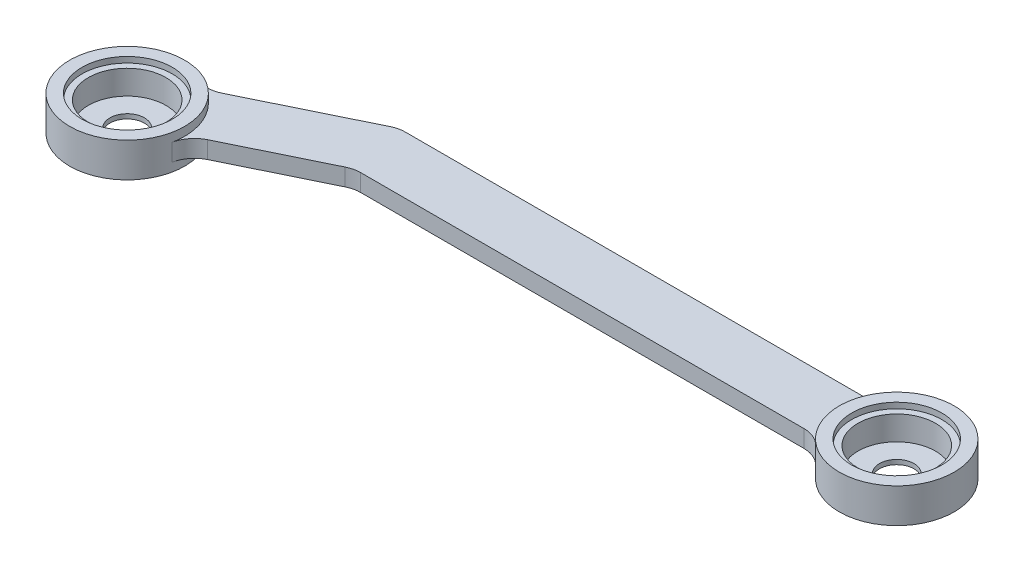
ISO-10303-21;
HEADER;
FILE_DESCRIPTION(('STEP AP214'),'2;1');
FILE_NAME('part.step','',(''),(''),'','','');
FILE_SCHEMA(('AUTOMOTIVE_DESIGN { 1 0 10303 214 1 1 1 1 }'));
ENDSEC;
DATA;
#1=APPLICATION_CONTEXT('core data for automotive mechanical design processes');
#2=APPLICATION_PROTOCOL_DEFINITION('international standard','automotive_design',2000,#1);
#3=PRODUCT_CONTEXT('',#1,'mechanical');
#4=PRODUCT('Part','Part','',(#3));
#5=PRODUCT_RELATED_PRODUCT_CATEGORY('part','',(#4));
#6=PRODUCT_DEFINITION_FORMATION('','',#4);
#7=PRODUCT_DEFINITION_CONTEXT('part definition',#1,'design');
#8=PRODUCT_DEFINITION('design','',#6,#7);
#9=PRODUCT_DEFINITION_SHAPE('','',#8);
#10=(LENGTH_UNIT() NAMED_UNIT(*) SI_UNIT(.MILLI.,.METRE.));
#11=(NAMED_UNIT(*) PLANE_ANGLE_UNIT() SI_UNIT($,.RADIAN.));
#12=(NAMED_UNIT(*) SI_UNIT($,.STERADIAN.) SOLID_ANGLE_UNIT());
#13=UNCERTAINTY_MEASURE_WITH_UNIT(LENGTH_MEASURE(1.E-05),#10,'distance_accuracy_value','');
#14=(GEOMETRIC_REPRESENTATION_CONTEXT(3) GLOBAL_UNCERTAINTY_ASSIGNED_CONTEXT((#13)) GLOBAL_UNIT_ASSIGNED_CONTEXT((#10,
#11,#12)) REPRESENTATION_CONTEXT('',''));
#15=CARTESIAN_POINT('',(0.,0.,0.));
#16=DIRECTION('',(0.,0.,1.));
#17=DIRECTION('',(1.,0.,0.));
#18=AXIS2_PLACEMENT_3D('',#15,#16,#17);
#19=CARTESIAN_POINT('',(-119.08,3.,14.86));
#20=DIRECTION('',(0.,-1.,0.));
#21=DIRECTION('',(0.,0.,-1.));
#22=AXIS2_PLACEMENT_3D('',#19,#20,#21);
#23=CYLINDRICAL_SURFACE('',#22,3.00000000000001);
#24=CARTESIAN_POINT('',(-119.08,-3.,14.86));
#25=DIRECTION('',(0.,1.,0.));
#26=DIRECTION('',(0.,0.,1.));
#27=AXIS2_PLACEMENT_3D('',#24,#25,#26);
#28=CIRCLE('',#27,3.00000000000001);
#29=CARTESIAN_POINT('',(-119.08,-3.,17.86));
#30=VERTEX_POINT('',#29);
#31=EDGE_CURVE('E292',#30,#30,#28,.T.);
#32=ORIENTED_EDGE('',*,*,#31,.F.);
#33=EDGE_LOOP('',(#32));
#34=FACE_BOUND('',#33,.T.);
#35=CARTESIAN_POINT('',(-119.08,-2.2,14.86));
#36=DIRECTION('',(0.,1.,0.));
#37=DIRECTION('',(0.,0.,1.));
#38=AXIS2_PLACEMENT_3D('',#35,#36,#37);
#39=CIRCLE('',#38,3.00000000000001);
#40=CARTESIAN_POINT('',(-119.08,-2.2,17.86));
#41=VERTEX_POINT('',#40);
#42=EDGE_CURVE('E45',#41,#41,#39,.T.);
#43=ORIENTED_EDGE('',*,*,#42,.T.);
#44=EDGE_LOOP('',(#43));
#45=FACE_BOUND('',#44,.T.);
#46=ADVANCED_FACE('F41',(#34,#45),#23,.F.);
#47=CARTESIAN_POINT('',(0.,3.,0.));
#48=DIRECTION('',(0.,-1.,0.));
#49=DIRECTION('',(0.,0.,-1.));
#50=AXIS2_PLACEMENT_3D('',#47,#48,#49);
#51=CYLINDRICAL_SURFACE('',#50,3.);
#52=CARTESIAN_POINT('',(0.,-3.,0.));
#53=DIRECTION('',(0.,1.,0.));
#54=DIRECTION('',(0.,0.,1.));
#55=AXIS2_PLACEMENT_3D('',#52,#53,#54);
#56=CIRCLE('',#55,3.);
#57=CARTESIAN_POINT('',(0.,-3.,3.));
#58=VERTEX_POINT('',#57);
#59=EDGE_CURVE('E276',#58,#58,#56,.T.);
#60=ORIENTED_EDGE('',*,*,#59,.F.);
#61=EDGE_LOOP('',(#60));
#62=FACE_BOUND('',#61,.T.);
#63=CARTESIAN_POINT('',(0.,-2.2,0.));
#64=DIRECTION('',(0.,1.,0.));
#65=DIRECTION('',(0.,0.,1.));
#66=AXIS2_PLACEMENT_3D('',#63,#64,#65);
#67=CIRCLE('',#66,3.);
#68=CARTESIAN_POINT('',(0.,-2.2,3.));
#69=VERTEX_POINT('',#68);
#70=EDGE_CURVE('E164',#69,#69,#67,.T.);
#71=ORIENTED_EDGE('',*,*,#70,.T.);
#72=EDGE_LOOP('',(#71));
#73=FACE_BOUND('',#72,.T.);
#74=ADVANCED_FACE('F43',(#62,#73),#51,.F.);
#75=CARTESIAN_POINT('',(-15.2191338214146,3.,-31.2035266615832));
#76=DIRECTION('',(0.438374799780225,0.,0.898792264607149));
#77=DIRECTION('',(0.898792264607149,0.,-0.438374799780225));
#78=AXIS2_PLACEMENT_3D('',#75,#76,#77);
#79=PLANE('',#78);
#80=DIRECTION('',(0.,-1.,0.));
#81=VECTOR('',#80,1.);
#82=CARTESIAN_POINT('',(-106.57224384308,3.,13.3528217762311));
#83=LINE('',#82,#81);
#84=CARTESIAN_POINT('',(-106.57224384308,1.5,13.3528217762311));
#85=VERTEX_POINT('',#84);
#86=CARTESIAN_POINT('',(-106.57224384308,-1.5,13.3528217762311));
#87=VERTEX_POINT('',#86);
#88=EDGE_CURVE('E272',#85,#87,#83,.T.);
#89=ORIENTED_EDGE('',*,*,#88,.T.);
#90=DIRECTION('',(-0.898792264607149,0.,0.438374799780225));
#91=VECTOR('',#90,1.);
#92=CARTESIAN_POINT('',(-15.2191338214146,-1.5,-31.2035266615832));
#93=LINE('',#92,#91);
#94=CARTESIAN_POINT('',(-90.4841202666175,-1.5,5.50603867696426));
#95=VERTEX_POINT('',#94);
#96=EDGE_CURVE('E229',#95,#87,#93,.T.);
#97=ORIENTED_EDGE('',*,*,#96,.F.);
#98=DIRECTION('',(0.,-1.,0.));
#99=VECTOR('',#98,1.);
#100=CARTESIAN_POINT('',(-90.4841202666175,3.,5.50603867696427));
#101=LINE('',#100,#99);
#102=CARTESIAN_POINT('',(-90.4841202666175,1.5,5.50603867696426));
#103=VERTEX_POINT('',#102);
#104=EDGE_CURVE('E155',#103,#95,#101,.T.);
#105=ORIENTED_EDGE('',*,*,#104,.F.);
#106=DIRECTION('',(-0.898792264607149,0.,0.438374799780225));
#107=VECTOR('',#106,1.);
#108=CARTESIAN_POINT('',(-15.2191338214146,1.5,-31.2035266615832));
#109=LINE('',#108,#107);
#110=EDGE_CURVE('E239',#103,#85,#109,.T.);
#111=ORIENTED_EDGE('',*,*,#110,.T.);
#112=EDGE_LOOP('',(#89,#97,#105,#111));
#113=FACE_BOUND('',#112,.T.);
#114=ADVANCED_FACE('F336',(#113),#79,.T.);
#115=CARTESIAN_POINT('',(-90.4914430284324,3.,0.));
#116=DIRECTION('',(0.,-1.,0.));
#117=DIRECTION('',(0.,0.,-1.));
#118=AXIS2_PLACEMENT_3D('',#115,#116,#117);
#119=CYLINDRICAL_SURFACE('',#118,5.);
#120=CARTESIAN_POINT('',(-90.4914430284324,-1.5,0.));
#121=DIRECTION('',(0.,-1.,0.));
#122=DIRECTION('',(0.,0.,-1.));
#123=AXIS2_PLACEMENT_3D('',#120,#121,#122);
#124=CIRCLE('',#123,5.);
#125=CARTESIAN_POINT('',(-92.6833170273335,-1.5,-4.49396132303573));
#126=VERTEX_POINT('',#125);
#127=CARTESIAN_POINT('',(-90.4914430284324,-1.5,-4.99999999999999));
#128=VERTEX_POINT('',#127);
#129=EDGE_CURVE('E207',#126,#128,#124,.T.);
#130=ORIENTED_EDGE('',*,*,#129,.F.);
#131=DIRECTION('',(0.,-1.,0.));
#132=VECTOR('',#131,1.);
#133=CARTESIAN_POINT('',(-92.6833170273335,3.,-4.49396132303573));
#134=LINE('',#133,#132);
#135=CARTESIAN_POINT('',(-92.6833170273335,1.5,-4.49396132303571));
#136=VERTEX_POINT('',#135);
#137=EDGE_CURVE('E11',#136,#126,#134,.T.);
#138=ORIENTED_EDGE('',*,*,#137,.F.);
#139=CARTESIAN_POINT('',(-90.4914430284324,1.5,0.));
#140=DIRECTION('',(0.,1.,0.));
#141=DIRECTION('',(0.,0.,1.));
#142=AXIS2_PLACEMENT_3D('',#139,#140,#141);
#143=CIRCLE('',#142,5.);
#144=CARTESIAN_POINT('',(-90.4914430284324,1.5,-4.99999999999999));
#145=VERTEX_POINT('',#144);
#146=EDGE_CURVE('E262',#145,#136,#143,.T.);
#147=ORIENTED_EDGE('',*,*,#146,.F.);
#148=DIRECTION('',(0.,-1.,0.));
#149=VECTOR('',#148,1.);
#150=CARTESIAN_POINT('',(-90.4914430284324,3.,-4.99999999999999));
#151=LINE('',#150,#149);
#152=EDGE_CURVE('E288',#145,#128,#151,.T.);
#153=ORIENTED_EDGE('',*,*,#152,.T.);
#154=EDGE_LOOP('',(#130,#138,#147,#153));
#155=FACE_BOUND('',#154,.T.);
#156=ADVANCED_FACE('F365',(#155),#119,.T.);
#157=CARTESIAN_POINT('',(-19.5818376745343,3.,-40.1483028620436));
#158=DIRECTION('',(0.438374799780225,0.,0.898792264607149));
#159=DIRECTION('',(0.898792264607149,0.,-0.438374799780226));
#160=AXIS2_PLACEMENT_3D('',#157,#158,#159);
#161=PLANE('',#160);
#162=DIRECTION('',(0.898792264607149,0.,-0.438374799780226));
#163=VECTOR('',#162,1.);
#164=CARTESIAN_POINT('',(-19.5818376745343,-1.5,-40.1483028620436));
#165=LINE('',#164,#163);
#166=CARTESIAN_POINT('',(-112.298830122142,-1.5,5.07326234380536));
#167=VERTEX_POINT('',#166);
#168=EDGE_CURVE('E150',#167,#126,#165,.T.);
#169=ORIENTED_EDGE('',*,*,#168,.F.);
#170=DIRECTION('',(0.,-1.,0.));
#171=VECTOR('',#170,1.);
#172=CARTESIAN_POINT('',(-112.298830122142,3.,5.07326234380535));
#173=LINE('',#172,#171);
#174=CARTESIAN_POINT('',(-112.298830122142,1.5,5.07326234380534));
#175=VERTEX_POINT('',#174);
#176=EDGE_CURVE('E51',#175,#167,#173,.T.);
#177=ORIENTED_EDGE('',*,*,#176,.F.);
#178=DIRECTION('',(-0.898792264607149,0.,0.438374799780226));
#179=VECTOR('',#178,1.);
#180=CARTESIAN_POINT('',(-19.5818376745343,1.5,-40.1483028620436));
#181=LINE('',#180,#179);
#182=EDGE_CURVE('E265',#136,#175,#181,.T.);
#183=ORIENTED_EDGE('',*,*,#182,.F.);
#184=ORIENTED_EDGE('',*,*,#137,.T.);
#185=EDGE_LOOP('',(#169,#177,#183,#184));
#186=FACE_BOUND('',#185,.T.);
#187=ADVANCED_FACE('F367',(#186),#161,.F.);
#188=CARTESIAN_POINT('',(-114.490704121043,3.,0.579301020769594));
#189=DIRECTION('',(0.,-1.,0.));
#190=DIRECTION('',(0.,0.,-1.));
#191=AXIS2_PLACEMENT_3D('',#188,#189,#190);
#192=CYLINDRICAL_SURFACE('',#191,5.);
#193=CARTESIAN_POINT('',(-114.490704121043,-1.5,0.579301020769594));
#194=DIRECTION('',(0.,-1.,0.));
#195=DIRECTION('',(0.,0.,-1.));
#196=AXIS2_PLACEMENT_3D('',#193,#194,#195);
#197=CIRCLE('',#196,5.);
#198=CARTESIAN_POINT('',(-116.020469414029,-1.5,5.3395340138464));
#199=VERTEX_POINT('',#198);
#200=EDGE_CURVE('E134',#199,#167,#197,.F.);
#201=ORIENTED_EDGE('',*,*,#200,.F.);
#202=DIRECTION('',(0.,-1.,0.));
#203=VECTOR('',#202,1.);
#204=CARTESIAN_POINT('',(-116.020469414029,3.,5.33953401384639));
#205=LINE('',#204,#203);
#206=CARTESIAN_POINT('',(-116.020469414029,1.5,5.3395340138464));
#207=VERTEX_POINT('',#206);
#208=EDGE_CURVE('E147',#207,#199,#205,.T.);
#209=ORIENTED_EDGE('',*,*,#208,.F.);
#210=CARTESIAN_POINT('',(-114.490704121043,1.5,0.579301020769594));
#211=DIRECTION('',(0.,1.,0.));
#212=DIRECTION('',(0.,0.,1.));
#213=AXIS2_PLACEMENT_3D('',#210,#211,#212);
#214=CIRCLE('',#213,5.);
#215=EDGE_CURVE('E268',#175,#207,#214,.F.);
#216=ORIENTED_EDGE('',*,*,#215,.F.);
#217=ORIENTED_EDGE('',*,*,#176,.T.);
#218=EDGE_LOOP('',(#201,#209,#216,#217));
#219=FACE_BOUND('',#218,.T.);
#220=ADVANCED_FACE('F145',(#219),#192,.F.);
#221=CARTESIAN_POINT('',(-88.2922462677163,3.,10.));
#222=DIRECTION('',(0.,-1.,0.));
#223=DIRECTION('',(0.,0.,-1.));
#224=AXIS2_PLACEMENT_3D('',#221,#222,#223);
#225=CYLINDRICAL_SURFACE('',#224,5.);
#226=ORIENTED_EDGE('',*,*,#104,.T.);
#227=CARTESIAN_POINT('',(-88.2922462677163,-1.5,10.));
#228=DIRECTION('',(0.,-1.,0.));
#229=DIRECTION('',(0.,0.,-1.));
#230=AXIS2_PLACEMENT_3D('',#227,#228,#229);
#231=CIRCLE('',#230,5.);
#232=CARTESIAN_POINT('',(-88.2922462677163,-1.5,5.));
#233=VERTEX_POINT('',#232);
#234=EDGE_CURVE('E226',#233,#95,#231,.F.);
#235=ORIENTED_EDGE('',*,*,#234,.F.);
#236=DIRECTION('',(0.,-1.,0.));
#237=VECTOR('',#236,1.);
#238=CARTESIAN_POINT('',(-88.2922462677163,3.,5.));
#239=LINE('',#238,#237);
#240=CARTESIAN_POINT('',(-88.2922462677163,1.5,5.));
#241=VERTEX_POINT('',#240);
#242=EDGE_CURVE('E161',#241,#233,#239,.T.);
#243=ORIENTED_EDGE('',*,*,#242,.F.);
#244=CARTESIAN_POINT('',(-88.2922462677163,1.5,10.));
#245=DIRECTION('',(0.,1.,0.));
#246=DIRECTION('',(0.,0.,1.));
#247=AXIS2_PLACEMENT_3D('',#244,#245,#246);
#248=CIRCLE('',#247,5.);
#249=EDGE_CURVE('E243',#103,#241,#248,.F.);
#250=ORIENTED_EDGE('',*,*,#249,.F.);
#251=EDGE_LOOP('',(#226,#235,#243,#250));
#252=FACE_BOUND('',#251,.T.);
#253=ADVANCED_FACE('F332',(#252),#225,.F.);
#254=CARTESIAN_POINT('',(0.,3.,5.));
#255=DIRECTION('',(0.,0.,1.));
#256=DIRECTION('',(1.,0.,0.));
#257=AXIS2_PLACEMENT_3D('',#254,#255,#256);
#258=PLANE('',#257);
#259=ORIENTED_EDGE('',*,*,#242,.T.);
#260=DIRECTION('',(-1.,0.,0.));
#261=VECTOR('',#260,1.);
#262=CARTESIAN_POINT('',(0.,-1.5,5.));
#263=LINE('',#262,#261);
#264=CARTESIAN_POINT('',(-11.180339887499,-1.5,5.));
#265=VERTEX_POINT('',#264);
#266=EDGE_CURVE('E223',#265,#233,#263,.T.);
#267=ORIENTED_EDGE('',*,*,#266,.F.);
#268=DIRECTION('',(0.,-1.,0.));
#269=VECTOR('',#268,1.);
#270=CARTESIAN_POINT('',(-11.180339887499,3.,5.));
#271=LINE('',#270,#269);
#272=CARTESIAN_POINT('',(-11.180339887499,1.5,5.));
#273=VERTEX_POINT('',#272);
#274=EDGE_CURVE('E318',#273,#265,#271,.T.);
#275=ORIENTED_EDGE('',*,*,#274,.F.);
#276=DIRECTION('',(1.,0.,0.));
#277=VECTOR('',#276,1.);
#278=CARTESIAN_POINT('',(0.,1.5,5.));
#279=LINE('',#278,#277);
#280=EDGE_CURVE('E246',#241,#273,#279,.T.);
#281=ORIENTED_EDGE('',*,*,#280,.F.);
#282=EDGE_LOOP('',(#259,#267,#275,#281));
#283=FACE_BOUND('',#282,.T.);
#284=ADVANCED_FACE('F327',(#283),#258,.T.);
#285=CARTESIAN_POINT('',(-11.180339887499,3.,10.));
#286=DIRECTION('',(0.,-1.,0.));
#287=DIRECTION('',(0.,0.,-1.));
#288=AXIS2_PLACEMENT_3D('',#285,#286,#287);
#289=CYLINDRICAL_SURFACE('',#288,5.);
#290=CARTESIAN_POINT('',(-11.180339887499,-1.5,10.));
#291=DIRECTION('',(0.,-1.,0.));
#292=DIRECTION('',(0.,0.,-1.));
#293=AXIS2_PLACEMENT_3D('',#290,#291,#292);
#294=CIRCLE('',#293,5.);
#295=CARTESIAN_POINT('',(-7.4535599249993,-1.5,6.66666666666666));
#296=VERTEX_POINT('',#295);
#297=EDGE_CURVE('E220',#296,#265,#294,.F.);
#298=ORIENTED_EDGE('',*,*,#297,.F.);
#299=DIRECTION('',(0.,-1.,0.));
#300=VECTOR('',#299,1.);
#301=CARTESIAN_POINT('',(-7.4535599249993,3.,6.66666666666666));
#302=LINE('',#301,#300);
#303=CARTESIAN_POINT('',(-7.4535599249993,1.5,6.66666666666666));
#304=VERTEX_POINT('',#303);
#305=EDGE_CURVE('E314',#304,#296,#302,.T.);
#306=ORIENTED_EDGE('',*,*,#305,.F.);
#307=CARTESIAN_POINT('',(-11.180339887499,1.5,10.));
#308=DIRECTION('',(0.,1.,0.));
#309=DIRECTION('',(0.,0.,1.));
#310=AXIS2_PLACEMENT_3D('',#307,#308,#309);
#311=CIRCLE('',#310,5.);
#312=EDGE_CURVE('E249',#273,#304,#311,.F.);
#313=ORIENTED_EDGE('',*,*,#312,.F.);
#314=ORIENTED_EDGE('',*,*,#274,.T.);
#315=EDGE_LOOP('',(#298,#306,#313,#314));
#316=FACE_BOUND('',#315,.T.);
#317=ADVANCED_FACE('F345',(#316),#289,.F.);
#318=CARTESIAN_POINT('',(-11.180339887499,3.,-10.));
#319=DIRECTION('',(0.,-1.,0.));
#320=DIRECTION('',(0.,0.,-1.));
#321=AXIS2_PLACEMENT_3D('',#318,#319,#320);
#322=CYLINDRICAL_SURFACE('',#321,5.);
#323=CARTESIAN_POINT('',(-11.180339887499,-1.5,-10.));
#324=DIRECTION('',(0.,-1.,0.));
#325=DIRECTION('',(0.,0.,-1.));
#326=AXIS2_PLACEMENT_3D('',#323,#324,#325);
#327=CIRCLE('',#326,5.);
#328=CARTESIAN_POINT('',(-11.180339887499,-1.5,-5.));
#329=VERTEX_POINT('',#328);
#330=CARTESIAN_POINT('',(-7.4535599249993,-1.5,-6.66666666666667));
#331=VERTEX_POINT('',#330);
#332=EDGE_CURVE('E213',#329,#331,#327,.F.);
#333=ORIENTED_EDGE('',*,*,#332,.F.);
#334=DIRECTION('',(0.,-1.,0.));
#335=VECTOR('',#334,1.);
#336=CARTESIAN_POINT('',(-11.180339887499,3.,-5.));
#337=LINE('',#336,#335);
#338=CARTESIAN_POINT('',(-11.180339887499,1.5,-5.));
#339=VERTEX_POINT('',#338);
#340=EDGE_CURVE('E306',#339,#329,#337,.T.);
#341=ORIENTED_EDGE('',*,*,#340,.F.);
#342=CARTESIAN_POINT('',(-11.180339887499,1.5,-10.));
#343=DIRECTION('',(0.,1.,0.));
#344=DIRECTION('',(0.,0.,1.));
#345=AXIS2_PLACEMENT_3D('',#342,#343,#344);
#346=CIRCLE('',#345,5.);
#347=CARTESIAN_POINT('',(-7.4535599249993,1.5,-6.66666666666667));
#348=VERTEX_POINT('',#347);
#349=EDGE_CURVE('E256',#348,#339,#346,.F.);
#350=ORIENTED_EDGE('',*,*,#349,.F.);
#351=DIRECTION('',(0.,-1.,0.));
#352=VECTOR('',#351,1.);
#353=CARTESIAN_POINT('',(-7.4535599249993,3.,-6.66666666666667));
#354=LINE('',#353,#352);
#355=EDGE_CURVE('E310',#348,#331,#354,.T.);
#356=ORIENTED_EDGE('',*,*,#355,.T.);
#357=EDGE_LOOP('',(#333,#341,#350,#356));
#358=FACE_BOUND('',#357,.T.);
#359=ADVANCED_FACE('F355',(#358),#322,.F.);
#360=CARTESIAN_POINT('',(0.,3.,-5.));
#361=DIRECTION('',(0.,0.,1.));
#362=DIRECTION('',(1.,0.,0.));
#363=AXIS2_PLACEMENT_3D('',#360,#361,#362);
#364=PLANE('',#363);
#365=DIRECTION('',(1.,0.,0.));
#366=VECTOR('',#365,1.);
#367=CARTESIAN_POINT('',(0.,-1.5,-5.));
#368=LINE('',#367,#366);
#369=EDGE_CURVE('E210',#128,#329,#368,.T.);
#370=ORIENTED_EDGE('',*,*,#369,.F.);
#371=ORIENTED_EDGE('',*,*,#152,.F.);
#372=DIRECTION('',(-1.,0.,0.));
#373=VECTOR('',#372,1.);
#374=CARTESIAN_POINT('',(0.,1.5,-5.));
#375=LINE('',#374,#373);
#376=EDGE_CURVE('E259',#339,#145,#375,.T.);
#377=ORIENTED_EDGE('',*,*,#376,.F.);
#378=ORIENTED_EDGE('',*,*,#340,.T.);
#379=EDGE_LOOP('',(#370,#371,#377,#378));
#380=FACE_BOUND('',#379,.T.);
#381=ADVANCED_FACE('F358',(#380),#364,.F.);
#382=CARTESIAN_POINT('',(-104.380369844179,3.,17.8467830992668));
#383=DIRECTION('',(0.,-1.,0.));
#384=DIRECTION('',(0.,0.,-1.));
#385=AXIS2_PLACEMENT_3D('',#382,#383,#384);
#386=CYLINDRICAL_SURFACE('',#385,5.);
#387=CARTESIAN_POINT('',(-104.380369844179,-1.5,17.8467830992668));
#388=DIRECTION('',(0.,-1.,0.));
#389=DIRECTION('',(0.,0.,-1.));
#390=AXIS2_PLACEMENT_3D('',#387,#388,#389);
#391=CIRCLE('',#390,5.);
#392=CARTESIAN_POINT('',(-109.280246562786,-1.5,16.8511887328446));
#393=VERTEX_POINT('',#392);
#394=EDGE_CURVE('E137',#87,#393,#391,.F.);
#395=ORIENTED_EDGE('',*,*,#394,.F.);
#396=ORIENTED_EDGE('',*,*,#88,.F.);
#397=CARTESIAN_POINT('',(-104.380369844179,1.5,17.8467830992668));
#398=DIRECTION('',(0.,1.,0.));
#399=DIRECTION('',(0.,0.,1.));
#400=AXIS2_PLACEMENT_3D('',#397,#398,#399);
#401=CIRCLE('',#400,5.);
#402=CARTESIAN_POINT('',(-109.280246562786,1.5,16.8511887328446));
#403=VERTEX_POINT('',#402);
#404=EDGE_CURVE('E236',#403,#85,#401,.F.);
#405=ORIENTED_EDGE('',*,*,#404,.F.);
#406=DIRECTION('',(0.,-1.,0.));
#407=VECTOR('',#406,1.);
#408=CARTESIAN_POINT('',(-109.280246562786,3.,16.8511887328446));
#409=LINE('',#408,#407);
#410=EDGE_CURVE('E271',#403,#393,#409,.T.);
#411=ORIENTED_EDGE('',*,*,#410,.T.);
#412=EDGE_LOOP('',(#395,#396,#405,#411));
#413=FACE_BOUND('',#412,.T.);
#414=ADVANCED_FACE('F339',(#413),#386,.F.);
#415=CARTESIAN_POINT('',(0.,-3.,0.));
#416=DIRECTION('',(0.,1.,0.));
#417=DIRECTION('',(0.,0.,1.));
#418=AXIS2_PLACEMENT_3D('',#415,#416,#417);
#419=PLANE('',#418);
#420=ORIENTED_EDGE('',*,*,#31,.T.);
#421=EDGE_LOOP('',(#420));
#422=FACE_BOUND('',#421,.T.);
#423=CARTESIAN_POINT('',(-119.08,-3.,14.86));
#424=DIRECTION('',(0.,1.,0.));
#425=DIRECTION('',(0.,0.,1.));
#426=AXIS2_PLACEMENT_3D('',#423,#424,#425);
#427=CIRCLE('',#426,10.);
#428=CARTESIAN_POINT('',(-119.08,-3.,24.86));
#429=VERTEX_POINT('',#428);
#430=EDGE_CURVE('E296',#429,#429,#427,.T.);
#431=ORIENTED_EDGE('',*,*,#430,.F.);
#432=EDGE_LOOP('',(#431));
#433=FACE_BOUND('',#432,.T.);
#434=ADVANCED_FACE('F426',(#422,#433),#419,.F.);
#435=ORIENTED_EDGE('',*,*,#59,.T.);
#436=EDGE_LOOP('',(#435));
#437=FACE_BOUND('',#436,.T.);
#438=CARTESIAN_POINT('',(0.,-3.,0.));
#439=DIRECTION('',(0.,1.,0.));
#440=DIRECTION('',(0.,0.,1.));
#441=AXIS2_PLACEMENT_3D('',#438,#439,#440);
#442=CIRCLE('',#441,10.);
#443=CARTESIAN_POINT('',(0.,-3.,10.));
#444=VERTEX_POINT('',#443);
#445=EDGE_CURVE('E284',#444,#444,#442,.T.);
#446=ORIENTED_EDGE('',*,*,#445,.F.);
#447=EDGE_LOOP('',(#446));
#448=FACE_BOUND('',#447,.T.);
#449=ADVANCED_FACE('F431',(#437,#448),#419,.F.);
#450=CARTESIAN_POINT('',(0.,3.,0.));
#451=DIRECTION('',(0.,1.,0.));
#452=DIRECTION('',(0.,0.,1.));
#453=AXIS2_PLACEMENT_3D('',#450,#451,#452);
#454=PLANE('',#453);
#455=CARTESIAN_POINT('',(-119.08,3.,14.86));
#456=DIRECTION('',(0.,1.,0.));
#457=DIRECTION('',(0.,0.,1.));
#458=AXIS2_PLACEMENT_3D('',#455,#456,#457);
#459=CIRCLE('',#458,7.85000000000001);
#460=CARTESIAN_POINT('',(-119.08,3.,22.71));
#461=VERTEX_POINT('',#460);
#462=EDGE_CURVE('E194',#461,#461,#459,.T.);
#463=ORIENTED_EDGE('',*,*,#462,.F.);
#464=EDGE_LOOP('',(#463));
#465=FACE_BOUND('',#464,.T.);
#466=CARTESIAN_POINT('',(-119.08,3.,14.86));
#467=DIRECTION('',(0.,1.,0.));
#468=DIRECTION('',(0.,0.,1.));
#469=AXIS2_PLACEMENT_3D('',#466,#467,#468);
#470=CIRCLE('',#469,10.);
#471=CARTESIAN_POINT('',(-119.08,3.,24.86));
#472=VERTEX_POINT('',#471);
#473=EDGE_CURVE('E279',#472,#472,#470,.T.);
#474=ORIENTED_EDGE('',*,*,#473,.T.);
#475=EDGE_LOOP('',(#474));
#476=FACE_BOUND('',#475,.T.);
#477=ADVANCED_FACE('F427',(#465,#476),#454,.T.);
#478=CARTESIAN_POINT('',(0.,3.,0.));
#479=DIRECTION('',(0.,1.,0.));
#480=DIRECTION('',(0.,0.,1.));
#481=AXIS2_PLACEMENT_3D('',#478,#479,#480);
#482=CIRCLE('',#481,7.85);
#483=CARTESIAN_POINT('',(0.,3.,7.85));
#484=VERTEX_POINT('',#483);
#485=EDGE_CURVE('E173',#484,#484,#482,.T.);
#486=ORIENTED_EDGE('',*,*,#485,.F.);
#487=EDGE_LOOP('',(#486));
#488=FACE_BOUND('',#487,.T.);
#489=CARTESIAN_POINT('',(0.,3.,0.));
#490=DIRECTION('',(0.,1.,0.));
#491=DIRECTION('',(0.,0.,1.));
#492=AXIS2_PLACEMENT_3D('',#489,#490,#491);
#493=CIRCLE('',#492,10.);
#494=CARTESIAN_POINT('',(0.,3.,10.));
#495=VERTEX_POINT('',#494);
#496=EDGE_CURVE('E283',#495,#495,#493,.T.);
#497=ORIENTED_EDGE('',*,*,#496,.T.);
#498=EDGE_LOOP('',(#497));
#499=FACE_BOUND('',#498,.T.);
#500=ADVANCED_FACE('F430',(#488,#499),#454,.T.);
#501=CARTESIAN_POINT('',(-119.08,3.,14.86));
#502=DIRECTION('',(0.,-1.,0.));
#503=DIRECTION('',(0.,0.,-1.));
#504=AXIS2_PLACEMENT_3D('',#501,#502,#503);
#505=CYLINDRICAL_SURFACE('',#504,10.);
#506=ORIENTED_EDGE('',*,*,#430,.T.);
#507=EDGE_LOOP('',(#506));
#508=FACE_BOUND('',#507,.T.);
#509=CARTESIAN_POINT('',(-119.08,1.5,14.86));
#510=DIRECTION('',(0.,1.,0.));
#511=DIRECTION('',(0.,0.,1.));
#512=AXIS2_PLACEMENT_3D('',#509,#510,#511);
#513=CIRCLE('',#512,10.);
#514=EDGE_CURVE('E59',#403,#207,#513,.T.);
#515=ORIENTED_EDGE('',*,*,#514,.T.);
#516=ORIENTED_EDGE('',*,*,#208,.T.);
#517=CARTESIAN_POINT('',(-119.08,-1.5,14.86));
#518=DIRECTION('',(0.,-1.,0.));
#519=DIRECTION('',(0.,0.,-1.));
#520=AXIS2_PLACEMENT_3D('',#517,#518,#519);
#521=CIRCLE('',#520,10.);
#522=EDGE_CURVE('E131',#199,#393,#521,.T.);
#523=ORIENTED_EDGE('',*,*,#522,.T.);
#524=ORIENTED_EDGE('',*,*,#410,.F.);
#525=EDGE_LOOP('',(#515,#516,#523,#524));
#526=FACE_BOUND('',#525,.T.);
#527=ORIENTED_EDGE('',*,*,#473,.F.);
#528=EDGE_LOOP('',(#527));
#529=FACE_BOUND('',#528,.T.);
#530=ADVANCED_FACE('F152',(#508,#526,#529),#505,.T.);
#531=CARTESIAN_POINT('',(0.,3.,0.));
#532=DIRECTION('',(0.,-1.,0.));
#533=DIRECTION('',(0.,0.,-1.));
#534=AXIS2_PLACEMENT_3D('',#531,#532,#533);
#535=CYLINDRICAL_SURFACE('',#534,10.);
#536=ORIENTED_EDGE('',*,*,#445,.T.);
#537=EDGE_LOOP('',(#536));
#538=FACE_BOUND('',#537,.T.);
#539=CARTESIAN_POINT('',(0.,1.5,0.));
#540=DIRECTION('',(0.,1.,0.));
#541=DIRECTION('',(0.,0.,1.));
#542=AXIS2_PLACEMENT_3D('',#539,#540,#541);
#543=CIRCLE('',#542,10.);
#544=EDGE_CURVE('E253',#348,#304,#543,.T.);
#545=ORIENTED_EDGE('',*,*,#544,.T.);
#546=ORIENTED_EDGE('',*,*,#305,.T.);
#547=CARTESIAN_POINT('',(0.,-1.5,0.));
#548=DIRECTION('',(0.,-1.,0.));
#549=DIRECTION('',(0.,0.,-1.));
#550=AXIS2_PLACEMENT_3D('',#547,#548,#549);
#551=CIRCLE('',#550,10.);
#552=EDGE_CURVE('E217',#296,#331,#551,.T.);
#553=ORIENTED_EDGE('',*,*,#552,.T.);
#554=ORIENTED_EDGE('',*,*,#355,.F.);
#555=EDGE_LOOP('',(#545,#546,#553,#554));
#556=FACE_BOUND('',#555,.T.);
#557=ORIENTED_EDGE('',*,*,#496,.F.);
#558=EDGE_LOOP('',(#557));
#559=FACE_BOUND('',#558,.T.);
#560=ADVANCED_FACE('F347',(#538,#556,#559),#535,.T.);
#561=CARTESIAN_POINT('',(0.,1.5,0.));
#562=DIRECTION('',(0.,1.,0.));
#563=DIRECTION('',(0.,0.,1.));
#564=AXIS2_PLACEMENT_3D('',#561,#562,#563);
#565=PLANE('',#564);
#566=ORIENTED_EDGE('',*,*,#514,.F.);
#567=ORIENTED_EDGE('',*,*,#404,.T.);
#568=ORIENTED_EDGE('',*,*,#110,.F.);
#569=ORIENTED_EDGE('',*,*,#249,.T.);
#570=ORIENTED_EDGE('',*,*,#280,.T.);
#571=ORIENTED_EDGE('',*,*,#312,.T.);
#572=ORIENTED_EDGE('',*,*,#544,.F.);
#573=ORIENTED_EDGE('',*,*,#349,.T.);
#574=ORIENTED_EDGE('',*,*,#376,.T.);
#575=ORIENTED_EDGE('',*,*,#146,.T.);
#576=ORIENTED_EDGE('',*,*,#182,.T.);
#577=ORIENTED_EDGE('',*,*,#215,.T.);
#578=EDGE_LOOP('',(#566,#567,#568,#569,#570,#571,#572,#573,#574,#575,#576,#577));
#579=FACE_BOUND('',#578,.T.);
#580=ADVANCED_FACE('F340',(#579),#565,.T.);
#581=CARTESIAN_POINT('',(0.,-1.5,0.));
#582=DIRECTION('',(0.,-1.,0.));
#583=DIRECTION('',(0.,0.,-1.));
#584=AXIS2_PLACEMENT_3D('',#581,#582,#583);
#585=PLANE('',#584);
#586=ORIENTED_EDGE('',*,*,#522,.F.);
#587=ORIENTED_EDGE('',*,*,#200,.T.);
#588=ORIENTED_EDGE('',*,*,#168,.T.);
#589=ORIENTED_EDGE('',*,*,#129,.T.);
#590=ORIENTED_EDGE('',*,*,#369,.T.);
#591=ORIENTED_EDGE('',*,*,#332,.T.);
#592=ORIENTED_EDGE('',*,*,#552,.F.);
#593=ORIENTED_EDGE('',*,*,#297,.T.);
#594=ORIENTED_EDGE('',*,*,#266,.T.);
#595=ORIENTED_EDGE('',*,*,#234,.T.);
#596=ORIENTED_EDGE('',*,*,#96,.T.);
#597=ORIENTED_EDGE('',*,*,#394,.T.);
#598=EDGE_LOOP('',(#586,#587,#588,#589,#590,#591,#592,#593,#594,#595,#596,#597));
#599=FACE_BOUND('',#598,.T.);
#600=ADVANCED_FACE('F133',(#599),#585,.T.);
#601=CARTESIAN_POINT('',(0.,2.,0.));
#602=DIRECTION('',(0.,1.,0.));
#603=DIRECTION('',(0.,0.,1.));
#604=AXIS2_PLACEMENT_3D('',#601,#602,#603);
#605=CYLINDRICAL_SURFACE('',#604,7.85);
#606=CARTESIAN_POINT('',(0.,2.,0.));
#607=DIRECTION('',(0.,1.,0.));
#608=DIRECTION('',(0.,0.,1.));
#609=AXIS2_PLACEMENT_3D('',#606,#607,#608);
#610=CIRCLE('',#609,7.85);
#611=CARTESIAN_POINT('',(0.,2.,7.85));
#612=VERTEX_POINT('',#611);
#613=EDGE_CURVE('E198',#612,#612,#610,.T.);
#614=ORIENTED_EDGE('',*,*,#613,.F.);
#615=EDGE_LOOP('',(#614));
#616=FACE_BOUND('',#615,.T.);
#617=ORIENTED_EDGE('',*,*,#485,.T.);
#618=EDGE_LOOP('',(#617));
#619=FACE_BOUND('',#618,.T.);
#620=ADVANCED_FACE('F415',(#616,#619),#605,.F.);
#621=CARTESIAN_POINT('',(0.,2.,0.));
#622=DIRECTION('',(0.,1.,0.));
#623=DIRECTION('',(0.,0.,1.));
#624=AXIS2_PLACEMENT_3D('',#621,#622,#623);
#625=PLANE('',#624);
#626=CARTESIAN_POINT('',(0.,2.,0.));
#627=DIRECTION('',(0.,1.,0.));
#628=DIRECTION('',(0.,0.,1.));
#629=AXIS2_PLACEMENT_3D('',#626,#627,#628);
#630=CIRCLE('',#629,6.75);
#631=CARTESIAN_POINT('',(0.,2.,6.75));
#632=VERTEX_POINT('',#631);
#633=EDGE_CURVE('E187',#632,#632,#630,.T.);
#634=ORIENTED_EDGE('',*,*,#633,.F.);
#635=EDGE_LOOP('',(#634));
#636=FACE_BOUND('',#635,.T.);
#637=ORIENTED_EDGE('',*,*,#613,.T.);
#638=EDGE_LOOP('',(#637));
#639=FACE_BOUND('',#638,.T.);
#640=ADVANCED_FACE('F411',(#636,#639),#625,.T.);
#641=CARTESIAN_POINT('',(-119.08,2.,14.86));
#642=DIRECTION('',(0.,1.,0.));
#643=DIRECTION('',(0.,0.,1.));
#644=AXIS2_PLACEMENT_3D('',#641,#642,#643);
#645=CYLINDRICAL_SURFACE('',#644,7.85000000000001);
#646=CARTESIAN_POINT('',(-119.08,2.,14.86));
#647=DIRECTION('',(0.,1.,0.));
#648=DIRECTION('',(0.,0.,1.));
#649=AXIS2_PLACEMENT_3D('',#646,#647,#648);
#650=CIRCLE('',#649,7.85000000000001);
#651=CARTESIAN_POINT('',(-119.08,2.,22.71));
#652=VERTEX_POINT('',#651);
#653=EDGE_CURVE('E140',#652,#652,#650,.T.);
#654=ORIENTED_EDGE('',*,*,#653,.F.);
#655=EDGE_LOOP('',(#654));
#656=FACE_BOUND('',#655,.T.);
#657=ORIENTED_EDGE('',*,*,#462,.T.);
#658=EDGE_LOOP('',(#657));
#659=FACE_BOUND('',#658,.T.);
#660=ADVANCED_FACE('F407',(#656,#659),#645,.F.);
#661=CARTESIAN_POINT('',(-119.08,2.,14.86));
#662=DIRECTION('',(0.,1.,0.));
#663=DIRECTION('',(0.,0.,1.));
#664=AXIS2_PLACEMENT_3D('',#661,#662,#663);
#665=PLANE('',#664);
#666=CARTESIAN_POINT('',(-119.08,2.,14.86));
#667=DIRECTION('',(0.,1.,0.));
#668=DIRECTION('',(0.,0.,1.));
#669=AXIS2_PLACEMENT_3D('',#666,#667,#668);
#670=CIRCLE('',#669,6.75);
#671=CARTESIAN_POINT('',(-119.08,2.,21.61));
#672=VERTEX_POINT('',#671);
#673=EDGE_CURVE('E175',#672,#672,#670,.T.);
#674=ORIENTED_EDGE('',*,*,#673,.F.);
#675=EDGE_LOOP('',(#674));
#676=FACE_BOUND('',#675,.T.);
#677=ORIENTED_EDGE('',*,*,#653,.T.);
#678=EDGE_LOOP('',(#677));
#679=FACE_BOUND('',#678,.T.);
#680=ADVANCED_FACE('F398',(#676,#679),#665,.T.);
#681=CARTESIAN_POINT('',(-119.08,-2.2,14.86));
#682=DIRECTION('',(0.,1.,0.));
#683=DIRECTION('',(0.,0.,1.));
#684=AXIS2_PLACEMENT_3D('',#681,#682,#683);
#685=CYLINDRICAL_SURFACE('',#684,6.75);
#686=CARTESIAN_POINT('',(-119.08,-2.2,14.86));
#687=DIRECTION('',(0.,1.,0.));
#688=DIRECTION('',(0.,0.,1.));
#689=AXIS2_PLACEMENT_3D('',#686,#687,#688);
#690=CIRCLE('',#689,6.75);
#691=CARTESIAN_POINT('',(-119.08,-2.2,21.61));
#692=VERTEX_POINT('',#691);
#693=EDGE_CURVE('E167',#692,#692,#690,.T.);
#694=ORIENTED_EDGE('',*,*,#693,.F.);
#695=EDGE_LOOP('',(#694));
#696=FACE_BOUND('',#695,.T.);
#697=ORIENTED_EDGE('',*,*,#673,.T.);
#698=EDGE_LOOP('',(#697));
#699=FACE_BOUND('',#698,.T.);
#700=ADVANCED_FACE('F389',(#696,#699),#685,.F.);
#701=CARTESIAN_POINT('',(-119.08,-2.2,14.86));
#702=DIRECTION('',(0.,1.,0.));
#703=DIRECTION('',(0.,0.,1.));
#704=AXIS2_PLACEMENT_3D('',#701,#702,#703);
#705=PLANE('',#704);
#706=ORIENTED_EDGE('',*,*,#42,.F.);
#707=EDGE_LOOP('',(#706));
#708=FACE_BOUND('',#707,.T.);
#709=ORIENTED_EDGE('',*,*,#693,.T.);
#710=EDGE_LOOP('',(#709));
#711=FACE_BOUND('',#710,.T.);
#712=ADVANCED_FACE('F386',(#708,#711),#705,.T.);
#713=CARTESIAN_POINT('',(0.,-2.2,0.));
#714=DIRECTION('',(0.,1.,0.));
#715=DIRECTION('',(0.,0.,1.));
#716=AXIS2_PLACEMENT_3D('',#713,#714,#715);
#717=CYLINDRICAL_SURFACE('',#716,6.75);
#718=CARTESIAN_POINT('',(0.,-2.2,0.));
#719=DIRECTION('',(0.,1.,0.));
#720=DIRECTION('',(0.,0.,1.));
#721=AXIS2_PLACEMENT_3D('',#718,#719,#720);
#722=CIRCLE('',#721,6.75);
#723=CARTESIAN_POINT('',(0.,-2.2,6.75));
#724=VERTEX_POINT('',#723);
#725=EDGE_CURVE('E181',#724,#724,#722,.T.);
#726=ORIENTED_EDGE('',*,*,#725,.F.);
#727=EDGE_LOOP('',(#726));
#728=FACE_BOUND('',#727,.T.);
#729=ORIENTED_EDGE('',*,*,#633,.T.);
#730=EDGE_LOOP('',(#729));
#731=FACE_BOUND('',#730,.T.);
#732=ADVANCED_FACE('F388',(#728,#731),#717,.F.);
#733=CARTESIAN_POINT('',(0.,-2.2,0.));
#734=DIRECTION('',(0.,1.,0.));
#735=DIRECTION('',(0.,0.,1.));
#736=AXIS2_PLACEMENT_3D('',#733,#734,#735);
#737=PLANE('',#736);
#738=ORIENTED_EDGE('',*,*,#70,.F.);
#739=EDGE_LOOP('',(#738));
#740=FACE_BOUND('',#739,.T.);
#741=ORIENTED_EDGE('',*,*,#725,.T.);
#742=EDGE_LOOP('',(#741));
#743=FACE_BOUND('',#742,.T.);
#744=ADVANCED_FACE('F395',(#740,#743),#737,.T.);
#745=CLOSED_SHELL('',(#46,#74,#114,#156,#187,#220,#253,#284,#317,#359,#381,#414,#434,#449,#477,
#500,#530,#560,#580,#600,#620,#640,#660,#680,#700,#712,#732,#744));
#746=MANIFOLD_SOLID_BREP('B2',#745);
#747=ADVANCED_BREP_SHAPE_REPRESENTATION('',(#18,#746),#14);
#748=SHAPE_DEFINITION_REPRESENTATION(#9,#747);
ENDSEC;
END-ISO-10303-21;
